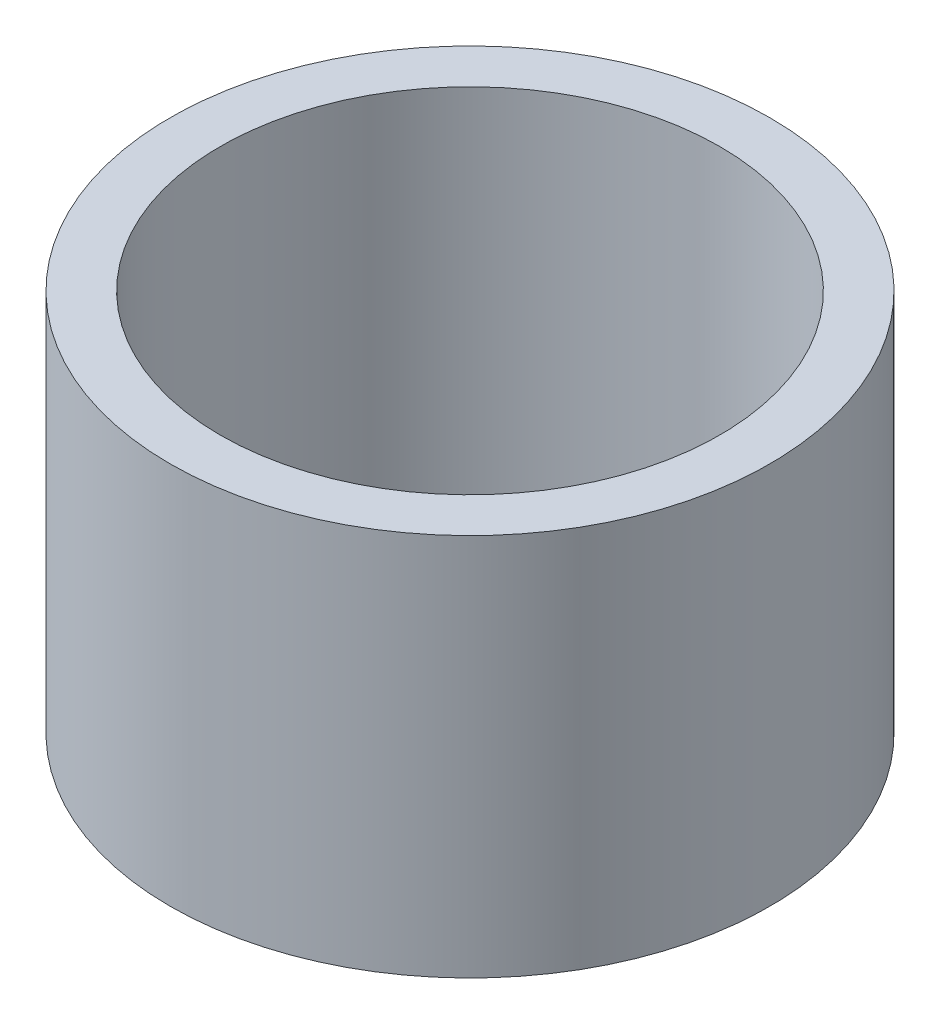
ISO-10303-21;
HEADER;
FILE_DESCRIPTION(('STEP AP214'),'2;1');
FILE_NAME('part.step','',(''),(''),'','','');
FILE_SCHEMA(('AUTOMOTIVE_DESIGN { 1 0 10303 214 1 1 1 1 }'));
ENDSEC;
DATA;
#1=APPLICATION_CONTEXT('core data for automotive mechanical design processes');
#2=APPLICATION_PROTOCOL_DEFINITION('international standard','automotive_design',2000,#1);
#3=PRODUCT_CONTEXT('',#1,'mechanical');
#4=PRODUCT('Part','Part','',(#3));
#5=PRODUCT_RELATED_PRODUCT_CATEGORY('part','',(#4));
#6=PRODUCT_DEFINITION_FORMATION('','',#4);
#7=PRODUCT_DEFINITION_CONTEXT('part definition',#1,'design');
#8=PRODUCT_DEFINITION('design','',#6,#7);
#9=PRODUCT_DEFINITION_SHAPE('','',#8);
#10=(LENGTH_UNIT() NAMED_UNIT(*) SI_UNIT(.MILLI.,.METRE.));
#11=(NAMED_UNIT(*) PLANE_ANGLE_UNIT() SI_UNIT($,.RADIAN.));
#12=(NAMED_UNIT(*) SI_UNIT($,.STERADIAN.) SOLID_ANGLE_UNIT());
#13=UNCERTAINTY_MEASURE_WITH_UNIT(LENGTH_MEASURE(1.E-05),#10,'distance_accuracy_value','');
#14=(GEOMETRIC_REPRESENTATION_CONTEXT(3) GLOBAL_UNCERTAINTY_ASSIGNED_CONTEXT((#13)) GLOBAL_UNIT_ASSIGNED_CONTEXT((#10,
#11,#12)) REPRESENTATION_CONTEXT('',''));
#15=CARTESIAN_POINT('',(0.,0.,0.));
#16=DIRECTION('',(0.,0.,1.));
#17=DIRECTION('',(1.,0.,0.));
#18=AXIS2_PLACEMENT_3D('',#15,#16,#17);
#19=CARTESIAN_POINT('',(0.,23.,0.));
#20=DIRECTION('',(0.,1.,0.));
#21=DIRECTION('',(0.,0.,1.));
#22=AXIS2_PLACEMENT_3D('',#19,#20,#21);
#23=PLANE('',#22);
#24=CARTESIAN_POINT('',(0.,23.,0.));
#25=DIRECTION('',(0.,1.,0.));
#26=DIRECTION('',(0.,0.,1.));
#27=AXIS2_PLACEMENT_3D('',#24,#25,#26);
#28=CIRCLE('',#27,18.);
#29=CARTESIAN_POINT('',(0.,23.,18.));
#30=VERTEX_POINT('',#29);
#31=EDGE_CURVE('E10',#30,#30,#28,.T.);
#32=ORIENTED_EDGE('',*,*,#31,.T.);
#33=EDGE_LOOP('',(#32));
#34=FACE_BOUND('',#33,.T.);
#35=CARTESIAN_POINT('',(0.,23.,0.));
#36=DIRECTION('',(0.,1.,0.));
#37=DIRECTION('',(0.,0.,1.));
#38=AXIS2_PLACEMENT_3D('',#35,#36,#37);
#39=CIRCLE('',#38,15.);
#40=CARTESIAN_POINT('',(0.,23.,15.));
#41=VERTEX_POINT('',#40);
#42=EDGE_CURVE('E41',#41,#41,#39,.T.);
#43=ORIENTED_EDGE('',*,*,#42,.F.);
#44=EDGE_LOOP('',(#43));
#45=FACE_BOUND('',#44,.T.);
#46=ADVANCED_FACE('F30',(#34,#45),#23,.T.);
#47=CARTESIAN_POINT('',(0.,0.,0.));
#48=DIRECTION('',(0.,1.,0.));
#49=DIRECTION('',(0.,0.,1.));
#50=AXIS2_PLACEMENT_3D('',#47,#48,#49);
#51=PLANE('',#50);
#52=CARTESIAN_POINT('',(0.,0.,0.));
#53=DIRECTION('',(0.,1.,0.));
#54=DIRECTION('',(0.,0.,1.));
#55=AXIS2_PLACEMENT_3D('',#52,#53,#54);
#56=CIRCLE('',#55,18.);
#57=CARTESIAN_POINT('',(0.,0.,18.));
#58=VERTEX_POINT('',#57);
#59=EDGE_CURVE('E34',#58,#58,#56,.T.);
#60=ORIENTED_EDGE('',*,*,#59,.F.);
#61=EDGE_LOOP('',(#60));
#62=FACE_BOUND('',#61,.T.);
#63=CARTESIAN_POINT('',(0.,0.,0.));
#64=DIRECTION('',(0.,1.,0.));
#65=DIRECTION('',(0.,0.,1.));
#66=AXIS2_PLACEMENT_3D('',#63,#64,#65);
#67=CIRCLE('',#66,15.);
#68=CARTESIAN_POINT('',(0.,0.,15.));
#69=VERTEX_POINT('',#68);
#70=EDGE_CURVE('E43',#69,#69,#67,.T.);
#71=ORIENTED_EDGE('',*,*,#70,.T.);
#72=EDGE_LOOP('',(#71));
#73=FACE_BOUND('',#72,.T.);
#74=ADVANCED_FACE('F53',(#62,#73),#51,.F.);
#75=CARTESIAN_POINT('',(0.,23.,0.));
#76=DIRECTION('',(0.,-1.,0.));
#77=DIRECTION('',(0.,0.,-1.));
#78=AXIS2_PLACEMENT_3D('',#75,#76,#77);
#79=CYLINDRICAL_SURFACE('',#78,18.);
#80=ORIENTED_EDGE('',*,*,#31,.F.);
#81=EDGE_LOOP('',(#80));
#82=FACE_BOUND('',#81,.T.);
#83=ORIENTED_EDGE('',*,*,#59,.T.);
#84=EDGE_LOOP('',(#83));
#85=FACE_BOUND('',#84,.T.);
#86=ADVANCED_FACE('F32',(#82,#85),#79,.T.);
#87=CARTESIAN_POINT('',(0.,23.,0.));
#88=DIRECTION('',(0.,-1.,0.));
#89=DIRECTION('',(0.,0.,-1.));
#90=AXIS2_PLACEMENT_3D('',#87,#88,#89);
#91=CYLINDRICAL_SURFACE('',#90,15.);
#92=ORIENTED_EDGE('',*,*,#42,.T.);
#93=EDGE_LOOP('',(#92));
#94=FACE_BOUND('',#93,.T.);
#95=ORIENTED_EDGE('',*,*,#70,.F.);
#96=EDGE_LOOP('',(#95));
#97=FACE_BOUND('',#96,.T.);
#98=ADVANCED_FACE('F49',(#94,#97),#91,.F.);
#99=CLOSED_SHELL('',(#46,#74,#86,#98));
#100=MANIFOLD_SOLID_BREP('B2',#99);
#101=ADVANCED_BREP_SHAPE_REPRESENTATION('',(#18,#100),#14);
#102=SHAPE_DEFINITION_REPRESENTATION(#9,#101);
ENDSEC;
END-ISO-10303-21;
